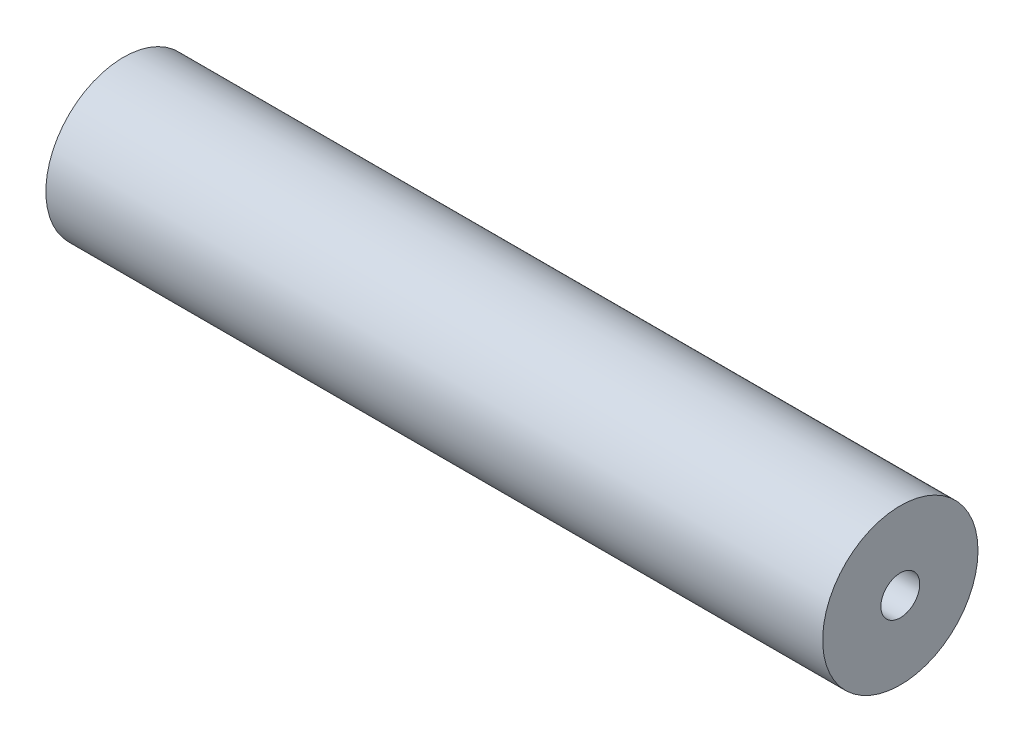
ISO-10303-21;
HEADER;
FILE_DESCRIPTION(('STEP AP214'),'2;1');
FILE_NAME('part.step','',(''),(''),'','','');
FILE_SCHEMA(('AUTOMOTIVE_DESIGN { 1 0 10303 214 1 1 1 1 }'));
ENDSEC;
DATA;
#1=APPLICATION_CONTEXT('core data for automotive mechanical design processes');
#2=APPLICATION_PROTOCOL_DEFINITION('international standard','automotive_design',2000,#1);
#3=PRODUCT_CONTEXT('',#1,'mechanical');
#4=PRODUCT('Part','Part','',(#3));
#5=PRODUCT_RELATED_PRODUCT_CATEGORY('part','',(#4));
#6=PRODUCT_DEFINITION_FORMATION('','',#4);
#7=PRODUCT_DEFINITION_CONTEXT('part definition',#1,'design');
#8=PRODUCT_DEFINITION('design','',#6,#7);
#9=PRODUCT_DEFINITION_SHAPE('','',#8);
#10=(LENGTH_UNIT() NAMED_UNIT(*) SI_UNIT(.MILLI.,.METRE.));
#11=(NAMED_UNIT(*) PLANE_ANGLE_UNIT() SI_UNIT($,.RADIAN.));
#12=(NAMED_UNIT(*) SI_UNIT($,.STERADIAN.) SOLID_ANGLE_UNIT());
#13=UNCERTAINTY_MEASURE_WITH_UNIT(LENGTH_MEASURE(1.E-05),#10,'distance_accuracy_value','');
#14=(GEOMETRIC_REPRESENTATION_CONTEXT(3) GLOBAL_UNCERTAINTY_ASSIGNED_CONTEXT((#13)) GLOBAL_UNIT_ASSIGNED_CONTEXT((#10,
#11,#12)) REPRESENTATION_CONTEXT('',''));
#15=CARTESIAN_POINT('',(0.,0.,0.));
#16=DIRECTION('',(0.,0.,1.));
#17=DIRECTION('',(1.,0.,0.));
#18=AXIS2_PLACEMENT_3D('',#15,#16,#17);
#19=CARTESIAN_POINT('',(254.,0.,0.));
#20=DIRECTION('',(-1.,0.,0.));
#21=DIRECTION('',(0.,0.,1.));
#22=AXIS2_PLACEMENT_3D('',#19,#20,#21);
#23=CYLINDRICAL_SURFACE('',#22,25.4);
#24=CARTESIAN_POINT('',(254.,0.,0.));
#25=DIRECTION('',(1.,0.,0.));
#26=DIRECTION('',(0.,0.,-1.));
#27=AXIS2_PLACEMENT_3D('',#24,#25,#26);
#28=CIRCLE('',#27,25.4);
#29=CARTESIAN_POINT('',(254.,0.,-25.4));
#30=VERTEX_POINT('',#29);
#31=EDGE_CURVE('E10',#30,#30,#28,.T.);
#32=ORIENTED_EDGE('',*,*,#31,.F.);
#33=EDGE_LOOP('',(#32));
#34=FACE_BOUND('',#33,.T.);
#35=CARTESIAN_POINT('',(0.,0.,0.));
#36=DIRECTION('',(1.,0.,0.));
#37=DIRECTION('',(0.,0.,-1.));
#38=AXIS2_PLACEMENT_3D('',#35,#36,#37);
#39=CIRCLE('',#38,25.4);
#40=CARTESIAN_POINT('',(0.,0.,-25.4));
#41=VERTEX_POINT('',#40);
#42=EDGE_CURVE('E34',#41,#41,#39,.T.);
#43=ORIENTED_EDGE('',*,*,#42,.T.);
#44=EDGE_LOOP('',(#43));
#45=FACE_BOUND('',#44,.T.);
#46=ADVANCED_FACE('F31',(#34,#45),#23,.T.);
#47=CARTESIAN_POINT('',(254.,0.,0.));
#48=DIRECTION('',(1.,0.,0.));
#49=DIRECTION('',(0.,0.,-1.));
#50=AXIS2_PLACEMENT_3D('',#47,#48,#49);
#51=PLANE('',#50);
#52=CARTESIAN_POINT('',(254.,0.,0.));
#53=DIRECTION('',(1.,0.,0.));
#54=DIRECTION('',(0.,0.,-1.));
#55=AXIS2_PLACEMENT_3D('',#52,#53,#54);
#56=CIRCLE('',#55,6.35);
#57=CARTESIAN_POINT('',(254.,0.,-6.35));
#58=VERTEX_POINT('',#57);
#59=EDGE_CURVE('E43',#58,#58,#56,.T.);
#60=ORIENTED_EDGE('',*,*,#59,.F.);
#61=EDGE_LOOP('',(#60));
#62=FACE_BOUND('',#61,.T.);
#63=ORIENTED_EDGE('',*,*,#31,.T.);
#64=EDGE_LOOP('',(#63));
#65=FACE_BOUND('',#64,.T.);
#66=ADVANCED_FACE('F58',(#62,#65),#51,.T.);
#67=CARTESIAN_POINT('',(0.,0.,0.));
#68=DIRECTION('',(1.,0.,0.));
#69=DIRECTION('',(0.,0.,-1.));
#70=AXIS2_PLACEMENT_3D('',#67,#68,#69);
#71=PLANE('',#70);
#72=CARTESIAN_POINT('',(0.,0.,0.));
#73=DIRECTION('',(1.,0.,0.));
#74=DIRECTION('',(0.,0.,-1.));
#75=AXIS2_PLACEMENT_3D('',#72,#73,#74);
#76=CIRCLE('',#75,6.35);
#77=CARTESIAN_POINT('',(0.,0.,-6.35));
#78=VERTEX_POINT('',#77);
#79=EDGE_CURVE('E41',#78,#78,#76,.T.);
#80=ORIENTED_EDGE('',*,*,#79,.T.);
#81=EDGE_LOOP('',(#80));
#82=FACE_BOUND('',#81,.T.);
#83=ORIENTED_EDGE('',*,*,#42,.F.);
#84=EDGE_LOOP('',(#83));
#85=FACE_BOUND('',#84,.T.);
#86=ADVANCED_FACE('F49',(#82,#85),#71,.F.);
#87=CARTESIAN_POINT('',(0.,0.,0.));
#88=DIRECTION('',(1.,0.,0.));
#89=DIRECTION('',(0.,0.,-1.));
#90=AXIS2_PLACEMENT_3D('',#87,#88,#89);
#91=CYLINDRICAL_SURFACE('',#90,6.35);
#92=ORIENTED_EDGE('',*,*,#79,.F.);
#93=EDGE_LOOP('',(#92));
#94=FACE_BOUND('',#93,.T.);
#95=ORIENTED_EDGE('',*,*,#59,.T.);
#96=EDGE_LOOP('',(#95));
#97=FACE_BOUND('',#96,.T.);
#98=ADVANCED_FACE('F52',(#94,#97),#91,.F.);
#99=CLOSED_SHELL('',(#46,#66,#86,#98));
#100=MANIFOLD_SOLID_BREP('B2',#99);
#101=ADVANCED_BREP_SHAPE_REPRESENTATION('',(#18,#100),#14);
#102=SHAPE_DEFINITION_REPRESENTATION(#9,#101);
ENDSEC;
END-ISO-10303-21;
